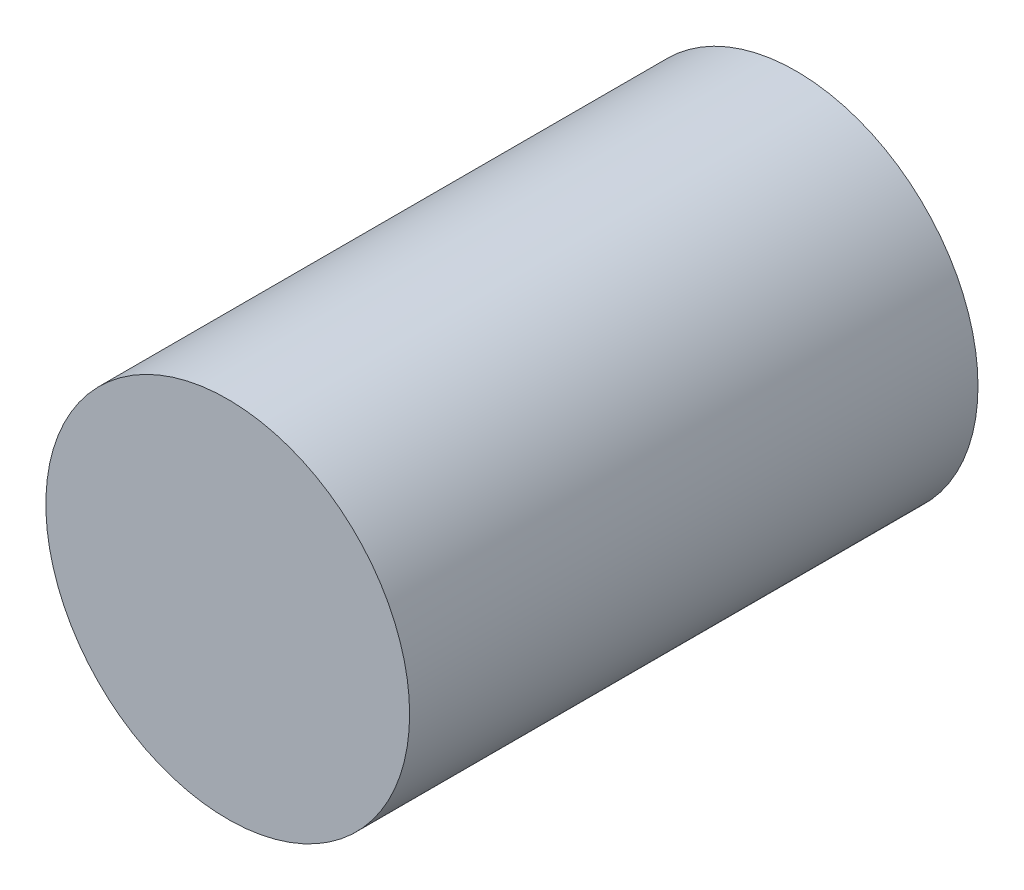
ISO-10303-21;
HEADER;
FILE_DESCRIPTION(('STEP AP214'),'2;1');
FILE_NAME('part.step','',(''),(''),'','','');
FILE_SCHEMA(('AUTOMOTIVE_DESIGN { 1 0 10303 214 1 1 1 1 }'));
ENDSEC;
DATA;
#1=APPLICATION_CONTEXT('core data for automotive mechanical design processes');
#2=APPLICATION_PROTOCOL_DEFINITION('international standard','automotive_design',2000,#1);
#3=PRODUCT_CONTEXT('',#1,'mechanical');
#4=PRODUCT('Part','Part','',(#3));
#5=PRODUCT_RELATED_PRODUCT_CATEGORY('part','',(#4));
#6=PRODUCT_DEFINITION_FORMATION('','',#4);
#7=PRODUCT_DEFINITION_CONTEXT('part definition',#1,'design');
#8=PRODUCT_DEFINITION('design','',#6,#7);
#9=PRODUCT_DEFINITION_SHAPE('','',#8);
#10=(LENGTH_UNIT() NAMED_UNIT(*) SI_UNIT(.MILLI.,.METRE.));
#11=(NAMED_UNIT(*) PLANE_ANGLE_UNIT() SI_UNIT($,.RADIAN.));
#12=(NAMED_UNIT(*) SI_UNIT($,.STERADIAN.) SOLID_ANGLE_UNIT());
#13=UNCERTAINTY_MEASURE_WITH_UNIT(LENGTH_MEASURE(1.E-05),#10,'distance_accuracy_value','');
#14=(GEOMETRIC_REPRESENTATION_CONTEXT(3) GLOBAL_UNCERTAINTY_ASSIGNED_CONTEXT((#13)) GLOBAL_UNIT_ASSIGNED_CONTEXT((#10,
#11,#12)) REPRESENTATION_CONTEXT('',''));
#15=CARTESIAN_POINT('',(0.,0.,0.));
#16=DIRECTION('',(0.,0.,1.));
#17=DIRECTION('',(1.,0.,0.));
#18=AXIS2_PLACEMENT_3D('',#15,#16,#17);
#19=CARTESIAN_POINT('',(0.,0.,12.7));
#20=DIRECTION('',(0.,0.,-1.));
#21=DIRECTION('',(-1.,0.,0.));
#22=AXIS2_PLACEMENT_3D('',#19,#20,#21);
#23=CYLINDRICAL_SURFACE('',#22,4.064);
#24=CARTESIAN_POINT('',(0.,0.,12.7));
#25=DIRECTION('',(0.,0.,1.));
#26=DIRECTION('',(1.,0.,0.));
#27=AXIS2_PLACEMENT_3D('',#24,#25,#26);
#28=CIRCLE('',#27,4.064);
#29=CARTESIAN_POINT('',(4.064,0.,12.7));
#30=VERTEX_POINT('',#29);
#31=EDGE_CURVE('E10',#30,#30,#28,.T.);
#32=ORIENTED_EDGE('',*,*,#31,.F.);
#33=EDGE_LOOP('',(#32));
#34=FACE_BOUND('',#33,.T.);
#35=CARTESIAN_POINT('',(0.,0.,0.));
#36=DIRECTION('',(0.,0.,1.));
#37=DIRECTION('',(1.,0.,0.));
#38=AXIS2_PLACEMENT_3D('',#35,#36,#37);
#39=CIRCLE('',#38,4.064);
#40=CARTESIAN_POINT('',(4.064,0.,0.));
#41=VERTEX_POINT('',#40);
#42=EDGE_CURVE('E45',#41,#41,#39,.T.);
#43=ORIENTED_EDGE('',*,*,#42,.T.);
#44=EDGE_LOOP('',(#43));
#45=FACE_BOUND('',#44,.T.);
#46=ADVANCED_FACE('F39',(#34,#45),#23,.T.);
#47=CARTESIAN_POINT('',(0.,0.,12.7));
#48=DIRECTION('',(0.,0.,1.));
#49=DIRECTION('',(1.,0.,0.));
#50=AXIS2_PLACEMENT_3D('',#47,#48,#49);
#51=PLANE('',#50);
#52=ORIENTED_EDGE('',*,*,#31,.T.);
#53=EDGE_LOOP('',(#52));
#54=FACE_BOUND('',#53,.T.);
#55=ADVANCED_FACE('F53',(#54),#51,.T.);
#56=CARTESIAN_POINT('',(0.,0.,0.));
#57=DIRECTION('',(0.,0.,1.));
#58=DIRECTION('',(1.,0.,0.));
#59=AXIS2_PLACEMENT_3D('',#56,#57,#58);
#60=PLANE('',#59);
#61=ORIENTED_EDGE('',*,*,#42,.F.);
#62=EDGE_LOOP('',(#61));
#63=FACE_BOUND('',#62,.T.);
#64=ADVANCED_FACE('F55',(#63),#60,.F.);
#65=CLOSED_SHELL('',(#46,#55,#64));
#66=MANIFOLD_SOLID_BREP('B2',#65);
#67=ADVANCED_BREP_SHAPE_REPRESENTATION('',(#18,#66),#14);
#68=SHAPE_DEFINITION_REPRESENTATION(#9,#67);
ENDSEC;
END-ISO-10303-21;
